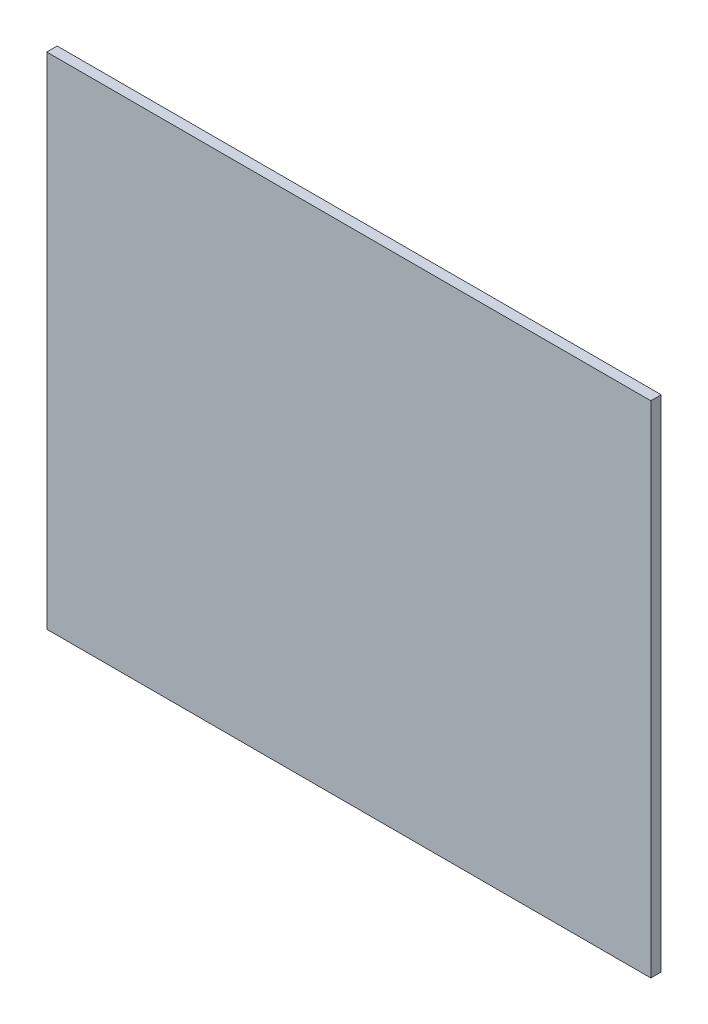
ISO-10303-21;
HEADER;
FILE_DESCRIPTION(('STEP AP214'),'2;1');
FILE_NAME('part.step','',(''),(''),'','','');
FILE_SCHEMA(('AUTOMOTIVE_DESIGN { 1 0 10303 214 1 1 1 1 }'));
ENDSEC;
DATA;
#1=APPLICATION_CONTEXT('core data for automotive mechanical design processes');
#2=APPLICATION_PROTOCOL_DEFINITION('international standard','automotive_design',2000,#1);
#3=PRODUCT_CONTEXT('',#1,'mechanical');
#4=PRODUCT('Part','Part','',(#3));
#5=PRODUCT_RELATED_PRODUCT_CATEGORY('part','',(#4));
#6=PRODUCT_DEFINITION_FORMATION('','',#4);
#7=PRODUCT_DEFINITION_CONTEXT('part definition',#1,'design');
#8=PRODUCT_DEFINITION('design','',#6,#7);
#9=PRODUCT_DEFINITION_SHAPE('','',#8);
#10=(LENGTH_UNIT() NAMED_UNIT(*) SI_UNIT(.MILLI.,.METRE.));
#11=(NAMED_UNIT(*) PLANE_ANGLE_UNIT() SI_UNIT($,.RADIAN.));
#12=(NAMED_UNIT(*) SI_UNIT($,.STERADIAN.) SOLID_ANGLE_UNIT());
#13=UNCERTAINTY_MEASURE_WITH_UNIT(LENGTH_MEASURE(1.E-05),#10,'distance_accuracy_value','');
#14=(GEOMETRIC_REPRESENTATION_CONTEXT(3) GLOBAL_UNCERTAINTY_ASSIGNED_CONTEXT((#13)) GLOBAL_UNIT_ASSIGNED_CONTEXT((#10,
#11,#12)) REPRESENTATION_CONTEXT('',''));
#15=CARTESIAN_POINT('',(0.,0.,0.));
#16=DIRECTION('',(0.,0.,1.));
#17=DIRECTION('',(1.,0.,0.));
#18=AXIS2_PLACEMENT_3D('',#15,#16,#17);
#19=CARTESIAN_POINT('',(-29.,24.,0.5));
#20=DIRECTION('',(1.,0.,0.));
#21=DIRECTION('',(0.,0.,-1.));
#22=AXIS2_PLACEMENT_3D('',#19,#20,#21);
#23=PLANE('',#22);
#24=DIRECTION('',(0.,-1.,0.));
#25=VECTOR('',#24,1.);
#26=CARTESIAN_POINT('',(-29.,24.,0.));
#27=LINE('',#26,#25);
#28=CARTESIAN_POINT('',(-29.,24.,0.));
#29=VERTEX_POINT('',#28);
#30=CARTESIAN_POINT('',(-29.,0.,0.));
#31=VERTEX_POINT('',#30);
#32=EDGE_CURVE('E98',#29,#31,#27,.T.);
#33=ORIENTED_EDGE('',*,*,#32,.T.);
#34=DIRECTION('',(0.,0.,-1.));
#35=VECTOR('',#34,1.);
#36=CARTESIAN_POINT('',(-29.,0.,0.5));
#37=LINE('',#36,#35);
#38=CARTESIAN_POINT('',(-29.,0.,0.5));
#39=VERTEX_POINT('',#38);
#40=EDGE_CURVE('E11',#39,#31,#37,.T.);
#41=ORIENTED_EDGE('',*,*,#40,.F.);
#42=DIRECTION('',(0.,-1.,0.));
#43=VECTOR('',#42,1.);
#44=CARTESIAN_POINT('',(-29.,24.,0.5));
#45=LINE('',#44,#43);
#46=CARTESIAN_POINT('',(-29.,24.,0.5));
#47=VERTEX_POINT('',#46);
#48=EDGE_CURVE('E86',#47,#39,#45,.T.);
#49=ORIENTED_EDGE('',*,*,#48,.F.);
#50=DIRECTION('',(0.,0.,-1.));
#51=VECTOR('',#50,1.);
#52=CARTESIAN_POINT('',(-29.,24.,0.5));
#53=LINE('',#52,#51);
#54=EDGE_CURVE('E94',#47,#29,#53,.T.);
#55=ORIENTED_EDGE('',*,*,#54,.T.);
#56=EDGE_LOOP('',(#33,#41,#49,#55));
#57=FACE_BOUND('',#56,.T.);
#58=ADVANCED_FACE('F35',(#57),#23,.F.);
#59=CARTESIAN_POINT('',(-29.,0.,0.5));
#60=DIRECTION('',(0.,1.,0.));
#61=DIRECTION('',(0.,0.,1.));
#62=AXIS2_PLACEMENT_3D('',#59,#60,#61);
#63=PLANE('',#62);
#64=DIRECTION('',(1.,0.,0.));
#65=VECTOR('',#64,1.);
#66=CARTESIAN_POINT('',(-29.,0.,0.));
#67=LINE('',#66,#65);
#68=CARTESIAN_POINT('',(0.,0.,0.));
#69=VERTEX_POINT('',#68);
#70=EDGE_CURVE('E90',#31,#69,#67,.T.);
#71=ORIENTED_EDGE('',*,*,#70,.T.);
#72=DIRECTION('',(0.,0.,-1.));
#73=VECTOR('',#72,1.);
#74=CARTESIAN_POINT('',(0.,0.,0.5));
#75=LINE('',#74,#73);
#76=CARTESIAN_POINT('',(0.,0.,0.5));
#77=VERTEX_POINT('',#76);
#78=EDGE_CURVE('E43',#77,#69,#75,.T.);
#79=ORIENTED_EDGE('',*,*,#78,.F.);
#80=DIRECTION('',(1.,0.,0.));
#81=VECTOR('',#80,1.);
#82=CARTESIAN_POINT('',(-29.,0.,0.5));
#83=LINE('',#82,#81);
#84=EDGE_CURVE('E81',#39,#77,#83,.T.);
#85=ORIENTED_EDGE('',*,*,#84,.F.);
#86=ORIENTED_EDGE('',*,*,#40,.T.);
#87=EDGE_LOOP('',(#71,#79,#85,#86));
#88=FACE_BOUND('',#87,.T.);
#89=ADVANCED_FACE('F89',(#88),#63,.F.);
#90=CARTESIAN_POINT('',(0.,24.,0.5));
#91=DIRECTION('',(-1.,0.,0.));
#92=DIRECTION('',(0.,0.,1.));
#93=AXIS2_PLACEMENT_3D('',#90,#91,#92);
#94=PLANE('',#93);
#95=DIRECTION('',(0.,1.,0.));
#96=VECTOR('',#95,1.);
#97=CARTESIAN_POINT('',(0.,24.,0.));
#98=LINE('',#97,#96);
#99=CARTESIAN_POINT('',(0.,24.,0.));
#100=VERTEX_POINT('',#99);
#101=EDGE_CURVE('E68',#69,#100,#98,.T.);
#102=ORIENTED_EDGE('',*,*,#101,.T.);
#103=DIRECTION('',(0.,0.,-1.));
#104=VECTOR('',#103,1.);
#105=CARTESIAN_POINT('',(0.,24.,0.5));
#106=LINE('',#105,#104);
#107=CARTESIAN_POINT('',(0.,24.,0.5));
#108=VERTEX_POINT('',#107);
#109=EDGE_CURVE('E91',#108,#100,#106,.T.);
#110=ORIENTED_EDGE('',*,*,#109,.F.);
#111=DIRECTION('',(0.,1.,0.));
#112=VECTOR('',#111,1.);
#113=CARTESIAN_POINT('',(0.,24.,0.5));
#114=LINE('',#113,#112);
#115=EDGE_CURVE('E84',#77,#108,#114,.T.);
#116=ORIENTED_EDGE('',*,*,#115,.F.);
#117=ORIENTED_EDGE('',*,*,#78,.T.);
#118=EDGE_LOOP('',(#102,#110,#116,#117));
#119=FACE_BOUND('',#118,.T.);
#120=ADVANCED_FACE('F92',(#119),#94,.F.);
#121=CARTESIAN_POINT('',(-29.,24.,0.5));
#122=DIRECTION('',(0.,-1.,0.));
#123=DIRECTION('',(1.,0.,0.));
#124=AXIS2_PLACEMENT_3D('',#121,#122,#123);
#125=PLANE('',#124);
#126=DIRECTION('',(-1.,0.,0.));
#127=VECTOR('',#126,1.);
#128=CARTESIAN_POINT('',(-29.,24.,0.));
#129=LINE('',#128,#127);
#130=EDGE_CURVE('E74',#100,#29,#129,.T.);
#131=ORIENTED_EDGE('',*,*,#130,.T.);
#132=ORIENTED_EDGE('',*,*,#54,.F.);
#133=DIRECTION('',(-1.,0.,0.));
#134=VECTOR('',#133,1.);
#135=CARTESIAN_POINT('',(-29.,24.,0.5));
#136=LINE('',#135,#134);
#137=EDGE_CURVE('E51',#108,#47,#136,.T.);
#138=ORIENTED_EDGE('',*,*,#137,.F.);
#139=ORIENTED_EDGE('',*,*,#109,.T.);
#140=EDGE_LOOP('',(#131,#132,#138,#139));
#141=FACE_BOUND('',#140,.T.);
#142=ADVANCED_FACE('F105',(#141),#125,.F.);
#143=CARTESIAN_POINT('',(0.,0.,0.5));
#144=DIRECTION('',(0.,0.,1.));
#145=DIRECTION('',(1.,0.,0.));
#146=AXIS2_PLACEMENT_3D('',#143,#144,#145);
#147=PLANE('',#146);
#148=ORIENTED_EDGE('',*,*,#48,.T.);
#149=ORIENTED_EDGE('',*,*,#84,.T.);
#150=ORIENTED_EDGE('',*,*,#115,.T.);
#151=ORIENTED_EDGE('',*,*,#137,.T.);
#152=EDGE_LOOP('',(#148,#149,#150,#151));
#153=FACE_BOUND('',#152,.T.);
#154=ADVANCED_FACE('F82',(#153),#147,.T.);
#155=CARTESIAN_POINT('',(0.,0.,0.));
#156=DIRECTION('',(0.,0.,1.));
#157=DIRECTION('',(1.,0.,0.));
#158=AXIS2_PLACEMENT_3D('',#155,#156,#157);
#159=PLANE('',#158);
#160=ORIENTED_EDGE('',*,*,#32,.F.);
#161=ORIENTED_EDGE('',*,*,#130,.F.);
#162=ORIENTED_EDGE('',*,*,#101,.F.);
#163=ORIENTED_EDGE('',*,*,#70,.F.);
#164=EDGE_LOOP('',(#160,#161,#162,#163));
#165=FACE_BOUND('',#164,.T.);
#166=ADVANCED_FACE('F108',(#165),#159,.F.);
#167=CLOSED_SHELL('',(#58,#89,#120,#142,#154,#166));
#168=MANIFOLD_SOLID_BREP('B2',#167);
#169=ADVANCED_BREP_SHAPE_REPRESENTATION('',(#18,#168),#14);
#170=SHAPE_DEFINITION_REPRESENTATION(#9,#169);
ENDSEC;
END-ISO-10303-21;
